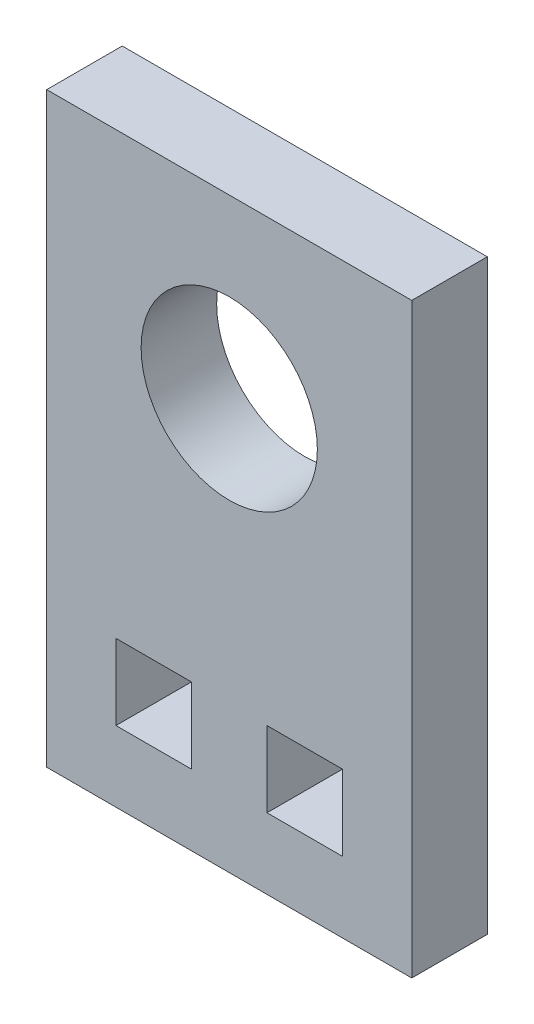
ISO-10303-21;
HEADER;
FILE_DESCRIPTION(('STEP AP214'),'2;1');
FILE_NAME('part.step','',(''),(''),'','','');
FILE_SCHEMA(('AUTOMOTIVE_DESIGN { 1 0 10303 214 1 1 1 1 }'));
ENDSEC;
DATA;
#1=APPLICATION_CONTEXT('core data for automotive mechanical design processes');
#2=APPLICATION_PROTOCOL_DEFINITION('international standard','automotive_design',2000,#1);
#3=PRODUCT_CONTEXT('',#1,'mechanical');
#4=PRODUCT('Part','Part','',(#3));
#5=PRODUCT_RELATED_PRODUCT_CATEGORY('part','',(#4));
#6=PRODUCT_DEFINITION_FORMATION('','',#4);
#7=PRODUCT_DEFINITION_CONTEXT('part definition',#1,'design');
#8=PRODUCT_DEFINITION('design','',#6,#7);
#9=PRODUCT_DEFINITION_SHAPE('','',#8);
#10=(LENGTH_UNIT() NAMED_UNIT(*) SI_UNIT(.MILLI.,.METRE.));
#11=(NAMED_UNIT(*) PLANE_ANGLE_UNIT() SI_UNIT($,.RADIAN.));
#12=(NAMED_UNIT(*) SI_UNIT($,.STERADIAN.) SOLID_ANGLE_UNIT());
#13=UNCERTAINTY_MEASURE_WITH_UNIT(LENGTH_MEASURE(1.E-05),#10,'distance_accuracy_value','');
#14=(GEOMETRIC_REPRESENTATION_CONTEXT(3) GLOBAL_UNCERTAINTY_ASSIGNED_CONTEXT((#13)) GLOBAL_UNIT_ASSIGNED_CONTEXT((#10,
#11,#12)) REPRESENTATION_CONTEXT('',''));
#15=CARTESIAN_POINT('',(0.,0.,0.));
#16=DIRECTION('',(0.,0.,1.));
#17=DIRECTION('',(1.,0.,0.));
#18=AXIS2_PLACEMENT_3D('',#15,#16,#17);
#19=CARTESIAN_POINT('',(0.,0.,3.));
#20=DIRECTION('',(0.,0.,-1.));
#21=DIRECTION('',(-1.,0.,0.));
#22=AXIS2_PLACEMENT_3D('',#19,#20,#21);
#23=PLANE('',#22);
#24=DIRECTION('',(1.,0.,0.));
#25=VECTOR('',#24,1.);
#26=CARTESIAN_POINT('',(-4.45643116806979,-7.13058560659966,3.));
#27=LINE('',#26,#25);
#28=CARTESIAN_POINT('',(-4.45643116806979,-7.13058560659966,3.));
#29=VERTEX_POINT('',#28);
#30=CARTESIAN_POINT('',(-1.45643116806979,-7.13058560659966,3.));
#31=VERTEX_POINT('',#30);
#32=EDGE_CURVE('E164',#29,#31,#27,.T.);
#33=ORIENTED_EDGE('',*,*,#32,.F.);
#34=DIRECTION('',(0.,-1.,0.));
#35=VECTOR('',#34,1.);
#36=CARTESIAN_POINT('',(-4.45643116806979,-7.13058560659966,3.));
#37=LINE('',#36,#35);
#38=CARTESIAN_POINT('',(-4.45643116806979,-4.13058560659966,3.));
#39=VERTEX_POINT('',#38);
#40=EDGE_CURVE('E172',#39,#29,#37,.T.);
#41=ORIENTED_EDGE('',*,*,#40,.F.);
#42=DIRECTION('',(-1.,0.,0.));
#43=VECTOR('',#42,1.);
#44=CARTESIAN_POINT('',(-4.45643116806979,-4.13058560659966,3.));
#45=LINE('',#44,#43);
#46=CARTESIAN_POINT('',(-1.45643116806979,-4.13058560659966,3.));
#47=VERTEX_POINT('',#46);
#48=EDGE_CURVE('E169',#47,#39,#45,.T.);
#49=ORIENTED_EDGE('',*,*,#48,.F.);
#50=DIRECTION('',(0.,1.,0.));
#51=VECTOR('',#50,1.);
#52=CARTESIAN_POINT('',(-1.45643116806979,-7.13058560659966,3.));
#53=LINE('',#52,#51);
#54=EDGE_CURVE('E166',#31,#47,#53,.T.);
#55=ORIENTED_EDGE('',*,*,#54,.F.);
#56=EDGE_LOOP('',(#33,#41,#49,#55));
#57=FACE_BOUND('',#56,.T.);
#58=DIRECTION('',(0.,1.,0.));
#59=VECTOR('',#58,1.);
#60=CARTESIAN_POINT('',(7.29356883193021,-6.93968540221812,3.));
#61=LINE('',#60,#59);
#62=CARTESIAN_POINT('',(7.29356883193021,-9.93968540221812,3.));
#63=VERTEX_POINT('',#62);
#64=CARTESIAN_POINT('',(7.2935688319302,13.3694143934003,3.));
#65=VERTEX_POINT('',#64);
#66=EDGE_CURVE('E195',#63,#65,#61,.T.);
#67=ORIENTED_EDGE('',*,*,#66,.T.);
#68=DIRECTION('',(-1.,0.,0.));
#69=VECTOR('',#68,1.);
#70=CARTESIAN_POINT('',(-7.2064311680698,13.3694143934003,3.));
#71=LINE('',#70,#69);
#72=CARTESIAN_POINT('',(-7.2064311680698,13.3694143934003,3.));
#73=VERTEX_POINT('',#72);
#74=EDGE_CURVE('E198',#65,#73,#71,.T.);
#75=ORIENTED_EDGE('',*,*,#74,.T.);
#76=DIRECTION('',(0.,-1.,0.));
#77=VECTOR('',#76,1.);
#78=CARTESIAN_POINT('',(-7.2064311680698,-7.13058560659967,3.));
#79=LINE('',#78,#77);
#80=CARTESIAN_POINT('',(-7.20643116806979,-9.93968540221812,3.));
#81=VERTEX_POINT('',#80);
#82=EDGE_CURVE('E201',#73,#81,#79,.T.);
#83=ORIENTED_EDGE('',*,*,#82,.T.);
#84=DIRECTION('',(1.,0.,0.));
#85=VECTOR('',#84,1.);
#86=CARTESIAN_POINT('',(-7.20643116806979,-9.93968540221812,3.));
#87=LINE('',#86,#85);
#88=EDGE_CURVE('E203',#81,#63,#87,.T.);
#89=ORIENTED_EDGE('',*,*,#88,.T.);
#90=EDGE_LOOP('',(#67,#75,#83,#89));
#91=FACE_BOUND('',#90,.T.);
#92=DIRECTION('',(0.,1.,0.));
#93=VECTOR('',#92,1.);
#94=CARTESIAN_POINT('',(4.54356883193021,-7.13058560659966,3.));
#95=LINE('',#94,#93);
#96=CARTESIAN_POINT('',(4.54356883193021,-7.13058560659966,3.));
#97=VERTEX_POINT('',#96);
#98=CARTESIAN_POINT('',(4.54356883193021,-4.13058560659966,3.));
#99=VERTEX_POINT('',#98);
#100=EDGE_CURVE('E125',#97,#99,#95,.T.);
#101=ORIENTED_EDGE('',*,*,#100,.F.);
#102=DIRECTION('',(1.,0.,0.));
#103=VECTOR('',#102,1.);
#104=CARTESIAN_POINT('',(1.54356883193021,-7.13058560659966,3.));
#105=LINE('',#104,#103);
#106=CARTESIAN_POINT('',(1.54356883193021,-7.13058560659966,3.));
#107=VERTEX_POINT('',#106);
#108=EDGE_CURVE('E148',#107,#97,#105,.T.);
#109=ORIENTED_EDGE('',*,*,#108,.F.);
#110=DIRECTION('',(0.,-1.,0.));
#111=VECTOR('',#110,1.);
#112=CARTESIAN_POINT('',(1.54356883193021,-7.13058560659966,3.));
#113=LINE('',#112,#111);
#114=CARTESIAN_POINT('',(1.54356883193021,-4.13058560659966,3.));
#115=VERTEX_POINT('',#114);
#116=EDGE_CURVE('E146',#115,#107,#113,.T.);
#117=ORIENTED_EDGE('',*,*,#116,.F.);
#118=DIRECTION('',(-1.,0.,0.));
#119=VECTOR('',#118,1.);
#120=CARTESIAN_POINT('',(4.54356883193021,-4.13058560659966,3.));
#121=LINE('',#120,#119);
#122=EDGE_CURVE('E133',#99,#115,#121,.T.);
#123=ORIENTED_EDGE('',*,*,#122,.F.);
#124=EDGE_LOOP('',(#101,#109,#117,#123));
#125=FACE_BOUND('',#124,.T.);
#126=CARTESIAN_POINT('',(0.0435688319302043,6.36941439340032,3.));
#127=DIRECTION('',(0.,0.,1.));
#128=DIRECTION('',(1.,0.,0.));
#129=AXIS2_PLACEMENT_3D('',#126,#127,#128);
#130=CIRCLE('',#129,3.5);
#131=CARTESIAN_POINT('',(3.5435688319302,6.36941439340032,3.));
#132=VERTEX_POINT('',#131);
#133=EDGE_CURVE('E154',#132,#132,#130,.T.);
#134=ORIENTED_EDGE('',*,*,#133,.F.);
#135=EDGE_LOOP('',(#134));
#136=FACE_BOUND('',#135,.T.);
#137=ADVANCED_FACE('F36',(#57,#91,#125,#136),#23,.F.);
#138=CARTESIAN_POINT('',(0.,0.,0.));
#139=DIRECTION('',(0.,0.,-1.));
#140=DIRECTION('',(-1.,0.,0.));
#141=AXIS2_PLACEMENT_3D('',#138,#139,#140);
#142=PLANE('',#141);
#143=DIRECTION('',(1.,0.,0.));
#144=VECTOR('',#143,1.);
#145=CARTESIAN_POINT('',(1.54356883193021,-7.13058560659966,0.));
#146=LINE('',#145,#144);
#147=CARTESIAN_POINT('',(1.54356883193021,-7.13058560659966,0.));
#148=VERTEX_POINT('',#147);
#149=CARTESIAN_POINT('',(4.54356883193021,-7.13058560659966,0.));
#150=VERTEX_POINT('',#149);
#151=EDGE_CURVE('E134',#148,#150,#146,.T.);
#152=ORIENTED_EDGE('',*,*,#151,.T.);
#153=DIRECTION('',(0.,1.,0.));
#154=VECTOR('',#153,1.);
#155=CARTESIAN_POINT('',(4.54356883193021,-7.13058560659966,0.));
#156=LINE('',#155,#154);
#157=CARTESIAN_POINT('',(4.54356883193021,-4.13058560659966,0.));
#158=VERTEX_POINT('',#157);
#159=EDGE_CURVE('E59',#150,#158,#156,.T.);
#160=ORIENTED_EDGE('',*,*,#159,.T.);
#161=DIRECTION('',(-1.,0.,0.));
#162=VECTOR('',#161,1.);
#163=CARTESIAN_POINT('',(4.54356883193021,-4.13058560659966,0.));
#164=LINE('',#163,#162);
#165=CARTESIAN_POINT('',(1.54356883193021,-4.13058560659966,0.));
#166=VERTEX_POINT('',#165);
#167=EDGE_CURVE('E140',#158,#166,#164,.T.);
#168=ORIENTED_EDGE('',*,*,#167,.T.);
#169=DIRECTION('',(0.,-1.,0.));
#170=VECTOR('',#169,1.);
#171=CARTESIAN_POINT('',(1.54356883193021,-7.13058560659966,0.));
#172=LINE('',#171,#170);
#173=EDGE_CURVE('E156',#166,#148,#172,.T.);
#174=ORIENTED_EDGE('',*,*,#173,.T.);
#175=EDGE_LOOP('',(#152,#160,#168,#174));
#176=FACE_BOUND('',#175,.T.);
#177=DIRECTION('',(0.,-1.,0.));
#178=VECTOR('',#177,1.);
#179=CARTESIAN_POINT('',(-4.45643116806979,-7.13058560659966,0.));
#180=LINE('',#179,#178);
#181=CARTESIAN_POINT('',(-4.45643116806979,-4.13058560659966,0.));
#182=VERTEX_POINT('',#181);
#183=CARTESIAN_POINT('',(-4.45643116806979,-7.13058560659966,0.));
#184=VERTEX_POINT('',#183);
#185=EDGE_CURVE('E167',#182,#184,#180,.T.);
#186=ORIENTED_EDGE('',*,*,#185,.T.);
#187=DIRECTION('',(1.,0.,0.));
#188=VECTOR('',#187,1.);
#189=CARTESIAN_POINT('',(-4.45643116806979,-7.13058560659966,0.));
#190=LINE('',#189,#188);
#191=CARTESIAN_POINT('',(-1.45643116806979,-7.13058560659966,0.));
#192=VERTEX_POINT('',#191);
#193=EDGE_CURVE('E141',#184,#192,#190,.T.);
#194=ORIENTED_EDGE('',*,*,#193,.T.);
#195=DIRECTION('',(0.,1.,0.));
#196=VECTOR('',#195,1.);
#197=CARTESIAN_POINT('',(-1.45643116806979,-7.13058560659966,0.));
#198=LINE('',#197,#196);
#199=CARTESIAN_POINT('',(-1.45643116806979,-4.13058560659966,0.));
#200=VERTEX_POINT('',#199);
#201=EDGE_CURVE('E177',#192,#200,#198,.T.);
#202=ORIENTED_EDGE('',*,*,#201,.T.);
#203=DIRECTION('',(-1.,0.,0.));
#204=VECTOR('',#203,1.);
#205=CARTESIAN_POINT('',(-4.45643116806979,-4.13058560659966,0.));
#206=LINE('',#205,#204);
#207=EDGE_CURVE('E180',#200,#182,#206,.T.);
#208=ORIENTED_EDGE('',*,*,#207,.T.);
#209=EDGE_LOOP('',(#186,#194,#202,#208));
#210=FACE_BOUND('',#209,.T.);
#211=DIRECTION('',(-1.,0.,0.));
#212=VECTOR('',#211,1.);
#213=CARTESIAN_POINT('',(-7.2064311680698,13.3694143934003,0.));
#214=LINE('',#213,#212);
#215=CARTESIAN_POINT('',(7.2935688319302,13.3694143934003,0.));
#216=VERTEX_POINT('',#215);
#217=CARTESIAN_POINT('',(-7.2064311680698,13.3694143934003,0.));
#218=VERTEX_POINT('',#217);
#219=EDGE_CURVE('E194',#216,#218,#214,.T.);
#220=ORIENTED_EDGE('',*,*,#219,.F.);
#221=DIRECTION('',(0.,1.,0.));
#222=VECTOR('',#221,1.);
#223=CARTESIAN_POINT('',(7.29356883193021,-6.93968540221812,0.));
#224=LINE('',#223,#222);
#225=CARTESIAN_POINT('',(7.29356883193021,-9.93968540221812,0.));
#226=VERTEX_POINT('',#225);
#227=EDGE_CURVE('E199',#226,#216,#224,.T.);
#228=ORIENTED_EDGE('',*,*,#227,.F.);
#229=DIRECTION('',(1.,0.,0.));
#230=VECTOR('',#229,1.);
#231=CARTESIAN_POINT('',(-7.20643116806979,-9.93968540221812,0.));
#232=LINE('',#231,#230);
#233=CARTESIAN_POINT('',(-7.20643116806979,-9.93968540221812,0.));
#234=VERTEX_POINT('',#233);
#235=EDGE_CURVE('E211',#234,#226,#232,.T.);
#236=ORIENTED_EDGE('',*,*,#235,.F.);
#237=DIRECTION('',(0.,-1.,0.));
#238=VECTOR('',#237,1.);
#239=CARTESIAN_POINT('',(-7.2064311680698,-7.13058560659967,0.));
#240=LINE('',#239,#238);
#241=EDGE_CURVE('E209',#218,#234,#240,.T.);
#242=ORIENTED_EDGE('',*,*,#241,.F.);
#243=EDGE_LOOP('',(#220,#228,#236,#242));
#244=FACE_BOUND('',#243,.T.);
#245=CARTESIAN_POINT('',(0.0435688319302043,6.36941439340032,0.));
#246=DIRECTION('',(0.,0.,1.));
#247=DIRECTION('',(1.,0.,0.));
#248=AXIS2_PLACEMENT_3D('',#245,#246,#247);
#249=CIRCLE('',#248,3.5);
#250=CARTESIAN_POINT('',(3.5435688319302,6.36941439340032,0.));
#251=VERTEX_POINT('',#250);
#252=EDGE_CURVE('E384',#251,#251,#249,.T.);
#253=ORIENTED_EDGE('',*,*,#252,.T.);
#254=EDGE_LOOP('',(#253));
#255=FACE_BOUND('',#254,.T.);
#256=ADVANCED_FACE('F229',(#176,#210,#244,#255),#142,.T.);
#257=CARTESIAN_POINT('',(-7.2064311680698,13.3694143934003,3.));
#258=DIRECTION('',(0.,-1.,0.));
#259=DIRECTION('',(1.,0.,0.));
#260=AXIS2_PLACEMENT_3D('',#257,#258,#259);
#261=PLANE('',#260);
#262=ORIENTED_EDGE('',*,*,#219,.T.);
#263=DIRECTION('',(0.,0.,-1.));
#264=VECTOR('',#263,1.);
#265=CARTESIAN_POINT('',(-7.2064311680698,13.3694143934003,3.));
#266=LINE('',#265,#264);
#267=EDGE_CURVE('E44',#73,#218,#266,.T.);
#268=ORIENTED_EDGE('',*,*,#267,.F.);
#269=ORIENTED_EDGE('',*,*,#74,.F.);
#270=DIRECTION('',(0.,0.,-1.));
#271=VECTOR('',#270,1.);
#272=CARTESIAN_POINT('',(7.2935688319302,13.3694143934003,3.));
#273=LINE('',#272,#271);
#274=EDGE_CURVE('E11',#65,#216,#273,.T.);
#275=ORIENTED_EDGE('',*,*,#274,.T.);
#276=EDGE_LOOP('',(#262,#268,#269,#275));
#277=FACE_BOUND('',#276,.T.);
#278=ADVANCED_FACE('F38',(#277),#261,.F.);
#279=CARTESIAN_POINT('',(-7.2064311680698,-7.13058560659967,3.));
#280=DIRECTION('',(1.,0.,0.));
#281=DIRECTION('',(0.,1.,0.));
#282=AXIS2_PLACEMENT_3D('',#279,#280,#281);
#283=PLANE('',#282);
#284=ORIENTED_EDGE('',*,*,#241,.T.);
#285=DIRECTION('',(0.,0.,-1.));
#286=VECTOR('',#285,1.);
#287=CARTESIAN_POINT('',(-7.20643116806979,-9.93968540221812,3.));
#288=LINE('',#287,#286);
#289=EDGE_CURVE('E216',#81,#234,#288,.T.);
#290=ORIENTED_EDGE('',*,*,#289,.F.);
#291=ORIENTED_EDGE('',*,*,#82,.F.);
#292=ORIENTED_EDGE('',*,*,#267,.T.);
#293=EDGE_LOOP('',(#284,#290,#291,#292));
#294=FACE_BOUND('',#293,.T.);
#295=ADVANCED_FACE('F222',(#294),#283,.F.);
#296=CARTESIAN_POINT('',(-7.20643116806979,-9.93968540221812,3.));
#297=DIRECTION('',(0.,1.,0.));
#298=DIRECTION('',(-1.,0.,0.));
#299=AXIS2_PLACEMENT_3D('',#296,#297,#298);
#300=PLANE('',#299);
#301=ORIENTED_EDGE('',*,*,#235,.T.);
#302=DIRECTION('',(0.,0.,-1.));
#303=VECTOR('',#302,1.);
#304=CARTESIAN_POINT('',(7.29356883193021,-9.93968540221812,3.));
#305=LINE('',#304,#303);
#306=EDGE_CURVE('E206',#63,#226,#305,.T.);
#307=ORIENTED_EDGE('',*,*,#306,.F.);
#308=ORIENTED_EDGE('',*,*,#88,.F.);
#309=ORIENTED_EDGE('',*,*,#289,.T.);
#310=EDGE_LOOP('',(#301,#307,#308,#309));
#311=FACE_BOUND('',#310,.T.);
#312=ADVANCED_FACE('F234',(#311),#300,.F.);
#313=CARTESIAN_POINT('',(7.29356883193021,-6.93968540221812,3.));
#314=DIRECTION('',(-1.,0.,0.));
#315=DIRECTION('',(0.,-1.,0.));
#316=AXIS2_PLACEMENT_3D('',#313,#314,#315);
#317=PLANE('',#316);
#318=ORIENTED_EDGE('',*,*,#227,.T.);
#319=ORIENTED_EDGE('',*,*,#274,.F.);
#320=ORIENTED_EDGE('',*,*,#66,.F.);
#321=ORIENTED_EDGE('',*,*,#306,.T.);
#322=EDGE_LOOP('',(#318,#319,#320,#321));
#323=FACE_BOUND('',#322,.T.);
#324=ADVANCED_FACE('F237',(#323),#317,.F.);
#325=CARTESIAN_POINT('',(-4.45643116806979,-7.13058560659966,3.));
#326=DIRECTION('',(0.,1.,0.));
#327=DIRECTION('',(0.,0.,1.));
#328=AXIS2_PLACEMENT_3D('',#325,#326,#327);
#329=PLANE('',#328);
#330=ORIENTED_EDGE('',*,*,#193,.F.);
#331=DIRECTION('',(0.,0.,-1.));
#332=VECTOR('',#331,1.);
#333=CARTESIAN_POINT('',(-4.45643116806979,-7.13058560659966,3.));
#334=LINE('',#333,#332);
#335=EDGE_CURVE('E174',#29,#184,#334,.T.);
#336=ORIENTED_EDGE('',*,*,#335,.F.);
#337=ORIENTED_EDGE('',*,*,#32,.T.);
#338=DIRECTION('',(0.,0.,-1.));
#339=VECTOR('',#338,1.);
#340=CARTESIAN_POINT('',(-1.45643116806979,-7.13058560659966,3.));
#341=LINE('',#340,#339);
#342=EDGE_CURVE('E191',#31,#192,#341,.T.);
#343=ORIENTED_EDGE('',*,*,#342,.T.);
#344=EDGE_LOOP('',(#330,#336,#337,#343));
#345=FACE_BOUND('',#344,.T.);
#346=ADVANCED_FACE('F249',(#345),#329,.T.);
#347=CARTESIAN_POINT('',(-1.45643116806979,-7.13058560659966,3.));
#348=DIRECTION('',(-1.,0.,0.));
#349=DIRECTION('',(0.,-1.,0.));
#350=AXIS2_PLACEMENT_3D('',#347,#348,#349);
#351=PLANE('',#350);
#352=ORIENTED_EDGE('',*,*,#201,.F.);
#353=ORIENTED_EDGE('',*,*,#342,.F.);
#354=ORIENTED_EDGE('',*,*,#54,.T.);
#355=DIRECTION('',(0.,0.,-1.));
#356=VECTOR('',#355,1.);
#357=CARTESIAN_POINT('',(-1.45643116806979,-4.13058560659966,3.));
#358=LINE('',#357,#356);
#359=EDGE_CURVE('E189',#47,#200,#358,.T.);
#360=ORIENTED_EDGE('',*,*,#359,.T.);
#361=EDGE_LOOP('',(#352,#353,#354,#360));
#362=FACE_BOUND('',#361,.T.);
#363=ADVANCED_FACE('F301',(#362),#351,.T.);
#364=CARTESIAN_POINT('',(-4.45643116806979,-4.13058560659966,3.));
#365=DIRECTION('',(0.,-1.,0.));
#366=DIRECTION('',(1.,0.,0.));
#367=AXIS2_PLACEMENT_3D('',#364,#365,#366);
#368=PLANE('',#367);
#369=ORIENTED_EDGE('',*,*,#207,.F.);
#370=ORIENTED_EDGE('',*,*,#359,.F.);
#371=ORIENTED_EDGE('',*,*,#48,.T.);
#372=DIRECTION('',(0.,0.,-1.));
#373=VECTOR('',#372,1.);
#374=CARTESIAN_POINT('',(-4.45643116806979,-4.13058560659966,3.));
#375=LINE('',#374,#373);
#376=EDGE_CURVE('E187',#39,#182,#375,.T.);
#377=ORIENTED_EDGE('',*,*,#376,.T.);
#378=EDGE_LOOP('',(#369,#370,#371,#377));
#379=FACE_BOUND('',#378,.T.);
#380=ADVANCED_FACE('F309',(#379),#368,.T.);
#381=CARTESIAN_POINT('',(-4.45643116806979,-7.13058560659966,3.));
#382=DIRECTION('',(1.,0.,0.));
#383=DIRECTION('',(0.,0.,-1.));
#384=AXIS2_PLACEMENT_3D('',#381,#382,#383);
#385=PLANE('',#384);
#386=ORIENTED_EDGE('',*,*,#185,.F.);
#387=ORIENTED_EDGE('',*,*,#376,.F.);
#388=ORIENTED_EDGE('',*,*,#40,.T.);
#389=ORIENTED_EDGE('',*,*,#335,.T.);
#390=EDGE_LOOP('',(#386,#387,#388,#389));
#391=FACE_BOUND('',#390,.T.);
#392=ADVANCED_FACE('F317',(#391),#385,.T.);
#393=CARTESIAN_POINT('',(4.54356883193021,-7.13058560659966,3.));
#394=DIRECTION('',(-1.,0.,0.));
#395=DIRECTION('',(0.,-1.,0.));
#396=AXIS2_PLACEMENT_3D('',#393,#394,#395);
#397=PLANE('',#396);
#398=ORIENTED_EDGE('',*,*,#159,.F.);
#399=DIRECTION('',(0.,0.,-1.));
#400=VECTOR('',#399,1.);
#401=CARTESIAN_POINT('',(4.54356883193021,-7.13058560659966,3.));
#402=LINE('',#401,#400);
#403=EDGE_CURVE('E129',#97,#150,#402,.T.);
#404=ORIENTED_EDGE('',*,*,#403,.F.);
#405=ORIENTED_EDGE('',*,*,#100,.T.);
#406=DIRECTION('',(0.,0.,-1.));
#407=VECTOR('',#406,1.);
#408=CARTESIAN_POINT('',(4.54356883193021,-4.13058560659966,3.));
#409=LINE('',#408,#407);
#410=EDGE_CURVE('E128',#99,#158,#409,.T.);
#411=ORIENTED_EDGE('',*,*,#410,.T.);
#412=EDGE_LOOP('',(#398,#404,#405,#411));
#413=FACE_BOUND('',#412,.T.);
#414=ADVANCED_FACE('F127',(#413),#397,.T.);
#415=CARTESIAN_POINT('',(4.54356883193021,-4.13058560659966,3.));
#416=DIRECTION('',(0.,-1.,0.));
#417=DIRECTION('',(0.,0.,-1.));
#418=AXIS2_PLACEMENT_3D('',#415,#416,#417);
#419=PLANE('',#418);
#420=ORIENTED_EDGE('',*,*,#167,.F.);
#421=ORIENTED_EDGE('',*,*,#410,.F.);
#422=ORIENTED_EDGE('',*,*,#122,.T.);
#423=DIRECTION('',(0.,0.,-1.));
#424=VECTOR('',#423,1.);
#425=CARTESIAN_POINT('',(1.54356883193021,-4.13058560659966,3.));
#426=LINE('',#425,#424);
#427=EDGE_CURVE('E142',#115,#166,#426,.T.);
#428=ORIENTED_EDGE('',*,*,#427,.T.);
#429=EDGE_LOOP('',(#420,#421,#422,#428));
#430=FACE_BOUND('',#429,.T.);
#431=ADVANCED_FACE('F137',(#430),#419,.T.);
#432=CARTESIAN_POINT('',(1.54356883193021,-7.13058560659966,3.));
#433=DIRECTION('',(1.,0.,0.));
#434=DIRECTION('',(0.,1.,0.));
#435=AXIS2_PLACEMENT_3D('',#432,#433,#434);
#436=PLANE('',#435);
#437=ORIENTED_EDGE('',*,*,#173,.F.);
#438=ORIENTED_EDGE('',*,*,#427,.F.);
#439=ORIENTED_EDGE('',*,*,#116,.T.);
#440=DIRECTION('',(0.,0.,-1.));
#441=VECTOR('',#440,1.);
#442=CARTESIAN_POINT('',(1.54356883193021,-7.13058560659966,3.));
#443=LINE('',#442,#441);
#444=EDGE_CURVE('E51',#107,#148,#443,.T.);
#445=ORIENTED_EDGE('',*,*,#444,.T.);
#446=EDGE_LOOP('',(#437,#438,#439,#445));
#447=FACE_BOUND('',#446,.T.);
#448=ADVANCED_FACE('F341',(#447),#436,.T.);
#449=CARTESIAN_POINT('',(1.54356883193021,-7.13058560659966,3.));
#450=DIRECTION('',(0.,1.,0.));
#451=DIRECTION('',(-1.,0.,0.));
#452=AXIS2_PLACEMENT_3D('',#449,#450,#451);
#453=PLANE('',#452);
#454=ORIENTED_EDGE('',*,*,#151,.F.);
#455=ORIENTED_EDGE('',*,*,#444,.F.);
#456=ORIENTED_EDGE('',*,*,#108,.T.);
#457=ORIENTED_EDGE('',*,*,#403,.T.);
#458=EDGE_LOOP('',(#454,#455,#456,#457));
#459=FACE_BOUND('',#458,.T.);
#460=ADVANCED_FACE('F349',(#459),#453,.T.);
#461=CARTESIAN_POINT('',(0.0435688319302043,6.36941439340032,3.));
#462=DIRECTION('',(0.,0.,-1.));
#463=DIRECTION('',(-1.,0.,0.));
#464=AXIS2_PLACEMENT_3D('',#461,#462,#463);
#465=CYLINDRICAL_SURFACE('',#464,3.5);
#466=ORIENTED_EDGE('',*,*,#133,.T.);
#467=EDGE_LOOP('',(#466));
#468=FACE_BOUND('',#467,.T.);
#469=ORIENTED_EDGE('',*,*,#252,.F.);
#470=EDGE_LOOP('',(#469));
#471=FACE_BOUND('',#470,.T.);
#472=ADVANCED_FACE('F358',(#468,#471),#465,.F.);
#473=CLOSED_SHELL('',(#137,#256,#278,#295,#312,#324,#346,#363,#380,#392,#414,#431,#448,#460,#472));
#474=MANIFOLD_SOLID_BREP('B2',#473);
#475=ADVANCED_BREP_SHAPE_REPRESENTATION('',(#18,#474),#14);
#476=SHAPE_DEFINITION_REPRESENTATION(#9,#475);
ENDSEC;
END-ISO-10303-21;
